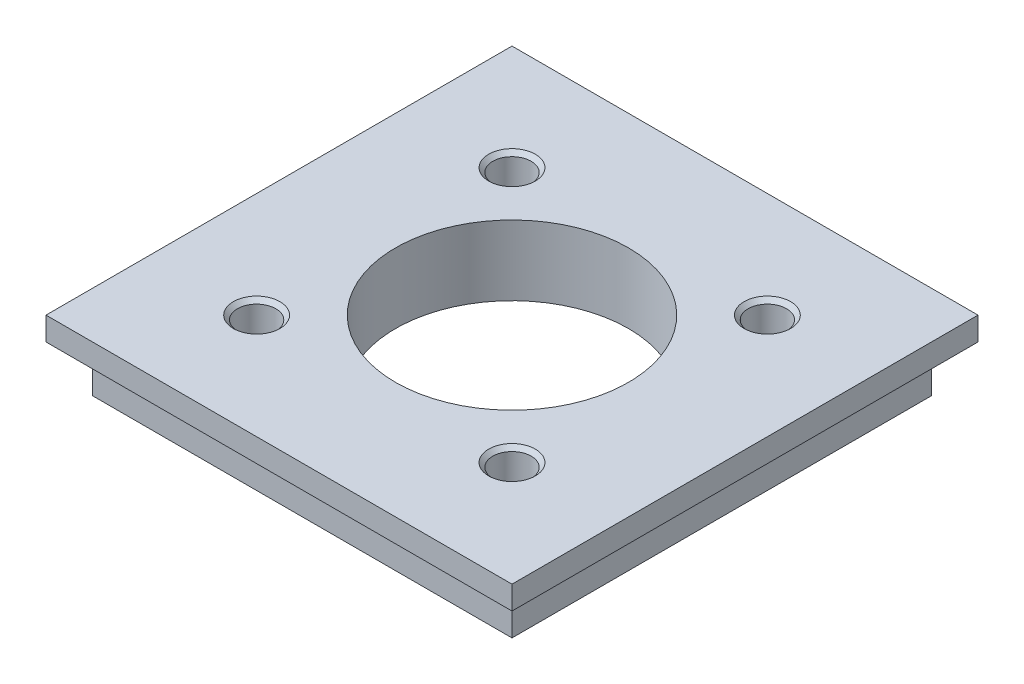
ISO-10303-21;
HEADER;
FILE_DESCRIPTION(('STEP AP214'),'2;1');
FILE_NAME('part.step','',(''),(''),'','','');
FILE_SCHEMA(('AUTOMOTIVE_DESIGN { 1 0 10303 214 1 1 1 1 }'));
ENDSEC;
DATA;
#1=APPLICATION_CONTEXT('core data for automotive mechanical design processes');
#2=APPLICATION_PROTOCOL_DEFINITION('international standard','automotive_design',2000,#1);
#3=PRODUCT_CONTEXT('',#1,'mechanical');
#4=PRODUCT('Part','Part','',(#3));
#5=PRODUCT_RELATED_PRODUCT_CATEGORY('part','',(#4));
#6=PRODUCT_DEFINITION_FORMATION('','',#4);
#7=PRODUCT_DEFINITION_CONTEXT('part definition',#1,'design');
#8=PRODUCT_DEFINITION('design','',#6,#7);
#9=PRODUCT_DEFINITION_SHAPE('','',#8);
#10=(LENGTH_UNIT() NAMED_UNIT(*) SI_UNIT(.MILLI.,.METRE.));
#11=(NAMED_UNIT(*) PLANE_ANGLE_UNIT() SI_UNIT($,.RADIAN.));
#12=(NAMED_UNIT(*) SI_UNIT($,.STERADIAN.) SOLID_ANGLE_UNIT());
#13=UNCERTAINTY_MEASURE_WITH_UNIT(LENGTH_MEASURE(1.E-05),#10,'distance_accuracy_value','');
#14=(GEOMETRIC_REPRESENTATION_CONTEXT(3) GLOBAL_UNCERTAINTY_ASSIGNED_CONTEXT((#13)) GLOBAL_UNIT_ASSIGNED_CONTEXT((#10,
#11,#12)) REPRESENTATION_CONTEXT('',''));
#15=CARTESIAN_POINT('',(0.,0.,0.));
#16=DIRECTION('',(0.,0.,1.));
#17=DIRECTION('',(1.,0.,0.));
#18=AXIS2_PLACEMENT_3D('',#15,#16,#17);
#19=CARTESIAN_POINT('',(20.,2.,20.));
#20=DIRECTION('',(-1.,0.,0.));
#21=DIRECTION('',(0.,0.,1.));
#22=AXIS2_PLACEMENT_3D('',#19,#20,#21);
#23=PLANE('',#22);
#24=DIRECTION('',(0.,0.,-1.));
#25=VECTOR('',#24,1.);
#26=CARTESIAN_POINT('',(20.,0.,20.));
#27=LINE('',#26,#25);
#28=CARTESIAN_POINT('',(20.,0.,20.));
#29=VERTEX_POINT('',#28);
#30=CARTESIAN_POINT('',(20.,0.,-20.));
#31=VERTEX_POINT('',#30);
#32=EDGE_CURVE('E139',#29,#31,#27,.T.);
#33=ORIENTED_EDGE('',*,*,#32,.T.);
#34=DIRECTION('',(0.,-1.,0.));
#35=VECTOR('',#34,1.);
#36=CARTESIAN_POINT('',(20.,2.,-20.));
#37=LINE('',#36,#35);
#38=CARTESIAN_POINT('',(20.,2.,-20.));
#39=VERTEX_POINT('',#38);
#40=EDGE_CURVE('E11',#39,#31,#37,.T.);
#41=ORIENTED_EDGE('',*,*,#40,.F.);
#42=DIRECTION('',(0.,0.,-1.));
#43=VECTOR('',#42,1.);
#44=CARTESIAN_POINT('',(20.,2.,20.));
#45=LINE('',#44,#43);
#46=CARTESIAN_POINT('',(20.,2.,20.));
#47=VERTEX_POINT('',#46);
#48=EDGE_CURVE('E145',#47,#39,#45,.T.);
#49=ORIENTED_EDGE('',*,*,#48,.F.);
#50=DIRECTION('',(0.,-1.,0.));
#51=VECTOR('',#50,1.);
#52=CARTESIAN_POINT('',(20.,2.,20.));
#53=LINE('',#52,#51);
#54=EDGE_CURVE('E159',#47,#29,#53,.T.);
#55=ORIENTED_EDGE('',*,*,#54,.T.);
#56=EDGE_LOOP('',(#33,#41,#49,#55));
#57=FACE_BOUND('',#56,.T.);
#58=ADVANCED_FACE('F45',(#57),#23,.F.);
#59=CARTESIAN_POINT('',(-20.,2.,-20.));
#60=DIRECTION('',(0.,0.,1.));
#61=DIRECTION('',(1.,0.,0.));
#62=AXIS2_PLACEMENT_3D('',#59,#60,#61);
#63=PLANE('',#62);
#64=DIRECTION('',(-1.,0.,0.));
#65=VECTOR('',#64,1.);
#66=CARTESIAN_POINT('',(-20.,0.,-20.));
#67=LINE('',#66,#65);
#68=CARTESIAN_POINT('',(-20.,0.,-20.));
#69=VERTEX_POINT('',#68);
#70=EDGE_CURVE('E163',#31,#69,#67,.T.);
#71=ORIENTED_EDGE('',*,*,#70,.T.);
#72=DIRECTION('',(0.,-1.,0.));
#73=VECTOR('',#72,1.);
#74=CARTESIAN_POINT('',(-20.,2.,-20.));
#75=LINE('',#74,#73);
#76=CARTESIAN_POINT('',(-20.,2.,-20.));
#77=VERTEX_POINT('',#76);
#78=EDGE_CURVE('E53',#77,#69,#75,.T.);
#79=ORIENTED_EDGE('',*,*,#78,.F.);
#80=DIRECTION('',(-1.,0.,0.));
#81=VECTOR('',#80,1.);
#82=CARTESIAN_POINT('',(-20.,2.,-20.));
#83=LINE('',#82,#81);
#84=EDGE_CURVE('E149',#39,#77,#83,.T.);
#85=ORIENTED_EDGE('',*,*,#84,.F.);
#86=ORIENTED_EDGE('',*,*,#40,.T.);
#87=EDGE_LOOP('',(#71,#79,#85,#86));
#88=FACE_BOUND('',#87,.T.);
#89=ADVANCED_FACE('F199',(#88),#63,.F.);
#90=CARTESIAN_POINT('',(-20.,2.,20.));
#91=DIRECTION('',(1.,0.,0.));
#92=DIRECTION('',(0.,0.,-1.));
#93=AXIS2_PLACEMENT_3D('',#90,#91,#92);
#94=PLANE('',#93);
#95=DIRECTION('',(0.,0.,1.));
#96=VECTOR('',#95,1.);
#97=CARTESIAN_POINT('',(-20.,0.,20.));
#98=LINE('',#97,#96);
#99=CARTESIAN_POINT('',(-20.,0.,20.));
#100=VERTEX_POINT('',#99);
#101=EDGE_CURVE('E166',#69,#100,#98,.T.);
#102=ORIENTED_EDGE('',*,*,#101,.T.);
#103=DIRECTION('',(0.,-1.,0.));
#104=VECTOR('',#103,1.);
#105=CARTESIAN_POINT('',(-20.,2.,20.));
#106=LINE('',#105,#104);
#107=CARTESIAN_POINT('',(-20.,2.,20.));
#108=VERTEX_POINT('',#107);
#109=EDGE_CURVE('E174',#108,#100,#106,.T.);
#110=ORIENTED_EDGE('',*,*,#109,.F.);
#111=DIRECTION('',(0.,0.,1.));
#112=VECTOR('',#111,1.);
#113=CARTESIAN_POINT('',(-20.,2.,20.));
#114=LINE('',#113,#112);
#115=EDGE_CURVE('E153',#77,#108,#114,.T.);
#116=ORIENTED_EDGE('',*,*,#115,.F.);
#117=ORIENTED_EDGE('',*,*,#78,.T.);
#118=EDGE_LOOP('',(#102,#110,#116,#117));
#119=FACE_BOUND('',#118,.T.);
#120=ADVANCED_FACE('F183',(#119),#94,.F.);
#121=CARTESIAN_POINT('',(-20.,2.,20.));
#122=DIRECTION('',(0.,0.,-1.));
#123=DIRECTION('',(-1.,0.,0.));
#124=AXIS2_PLACEMENT_3D('',#121,#122,#123);
#125=PLANE('',#124);
#126=DIRECTION('',(1.,0.,0.));
#127=VECTOR('',#126,1.);
#128=CARTESIAN_POINT('',(-20.,0.,20.));
#129=LINE('',#128,#127);
#130=EDGE_CURVE('E150',#100,#29,#129,.T.);
#131=ORIENTED_EDGE('',*,*,#130,.T.);
#132=ORIENTED_EDGE('',*,*,#54,.F.);
#133=DIRECTION('',(1.,0.,0.));
#134=VECTOR('',#133,1.);
#135=CARTESIAN_POINT('',(-20.,2.,20.));
#136=LINE('',#135,#134);
#137=EDGE_CURVE('E156',#108,#47,#136,.T.);
#138=ORIENTED_EDGE('',*,*,#137,.F.);
#139=ORIENTED_EDGE('',*,*,#109,.T.);
#140=EDGE_LOOP('',(#131,#132,#138,#139));
#141=FACE_BOUND('',#140,.T.);
#142=ADVANCED_FACE('F192',(#141),#125,.F.);
#143=CARTESIAN_POINT('',(0.,2.,0.));
#144=DIRECTION('',(0.,-1.,0.));
#145=DIRECTION('',(0.,0.,-1.));
#146=AXIS2_PLACEMENT_3D('',#143,#144,#145);
#147=PLANE('',#146);
#148=CARTESIAN_POINT('',(10.9601551083915,2.,-10.9601551083915));
#149=DIRECTION('',(0.,1.,0.));
#150=DIRECTION('',(0.,0.,1.));
#151=AXIS2_PLACEMENT_3D('',#148,#149,#150);
#152=CIRCLE('',#151,2.);
#153=CARTESIAN_POINT('',(10.9601551083915,2.,-8.96015510839151));
#154=VERTEX_POINT('',#153);
#155=EDGE_CURVE('E272',#154,#154,#152,.T.);
#156=ORIENTED_EDGE('',*,*,#155,.F.);
#157=EDGE_LOOP('',(#156));
#158=FACE_BOUND('',#157,.T.);
#159=CARTESIAN_POINT('',(10.9601551083922,2.,10.9601551083915));
#160=DIRECTION('',(0.,1.,0.));
#161=DIRECTION('',(0.,0.,1.));
#162=AXIS2_PLACEMENT_3D('',#159,#160,#161);
#163=CIRCLE('',#162,2.);
#164=CARTESIAN_POINT('',(10.9601551083922,2.,12.9601551083915));
#165=VERTEX_POINT('',#164);
#166=EDGE_CURVE('E282',#165,#165,#163,.T.);
#167=ORIENTED_EDGE('',*,*,#166,.F.);
#168=EDGE_LOOP('',(#167));
#169=FACE_BOUND('',#168,.T.);
#170=CARTESIAN_POINT('',(-10.9601551083907,2.,10.9601551083922));
#171=DIRECTION('',(0.,1.,0.));
#172=DIRECTION('',(0.,0.,1.));
#173=AXIS2_PLACEMENT_3D('',#170,#171,#172);
#174=CIRCLE('',#173,2.);
#175=CARTESIAN_POINT('',(-10.9601551083907,2.,12.9601551083922));
#176=VERTEX_POINT('',#175);
#177=EDGE_CURVE('E294',#176,#176,#174,.T.);
#178=ORIENTED_EDGE('',*,*,#177,.F.);
#179=EDGE_LOOP('',(#178));
#180=FACE_BOUND('',#179,.T.);
#181=CARTESIAN_POINT('',(-10.9601551083915,2.,-10.9601551083908));
#182=DIRECTION('',(0.,1.,0.));
#183=DIRECTION('',(0.,0.,1.));
#184=AXIS2_PLACEMENT_3D('',#181,#182,#183);
#185=CIRCLE('',#184,2.);
#186=CARTESIAN_POINT('',(-10.9601551083915,2.,-8.96015510839075));
#187=VERTEX_POINT('',#186);
#188=EDGE_CURVE('E306',#187,#187,#185,.T.);
#189=ORIENTED_EDGE('',*,*,#188,.F.);
#190=EDGE_LOOP('',(#189));
#191=FACE_BOUND('',#190,.T.);
#192=CARTESIAN_POINT('',(0.,2.,0.));
#193=DIRECTION('',(0.,-1.,0.));
#194=DIRECTION('',(0.,0.,-1.));
#195=AXIS2_PLACEMENT_3D('',#192,#193,#194);
#196=CIRCLE('',#195,10.);
#197=CARTESIAN_POINT('',(0.,2.,-10.));
#198=VERTEX_POINT('',#197);
#199=EDGE_CURVE('E134',#198,#198,#196,.T.);
#200=ORIENTED_EDGE('',*,*,#199,.T.);
#201=EDGE_LOOP('',(#200));
#202=FACE_BOUND('',#201,.T.);
#203=ORIENTED_EDGE('',*,*,#48,.T.);
#204=ORIENTED_EDGE('',*,*,#84,.T.);
#205=ORIENTED_EDGE('',*,*,#115,.T.);
#206=ORIENTED_EDGE('',*,*,#137,.T.);
#207=EDGE_LOOP('',(#203,#204,#205,#206));
#208=FACE_BOUND('',#207,.T.);
#209=ADVANCED_FACE('F198',(#158,#169,#180,#191,#202,#208),#147,.F.);
#210=CARTESIAN_POINT('',(0.,0.,0.));
#211=DIRECTION('',(0.,-1.,0.));
#212=DIRECTION('',(0.,0.,-1.));
#213=AXIS2_PLACEMENT_3D('',#210,#211,#212);
#214=PLANE('',#213);
#215=DIRECTION('',(1.,0.,0.));
#216=VECTOR('',#215,1.);
#217=CARTESIAN_POINT('',(-18.,0.,-18.));
#218=LINE('',#217,#216);
#219=CARTESIAN_POINT('',(-18.,0.,-18.));
#220=VERTEX_POINT('',#219);
#221=CARTESIAN_POINT('',(18.,0.,-18.));
#222=VERTEX_POINT('',#221);
#223=EDGE_CURVE('E60',#220,#222,#218,.T.);
#224=ORIENTED_EDGE('',*,*,#223,.F.);
#225=DIRECTION('',(0.,0.,-1.));
#226=VECTOR('',#225,1.);
#227=CARTESIAN_POINT('',(-18.,0.,18.));
#228=LINE('',#227,#226);
#229=CARTESIAN_POINT('',(-18.,0.,18.));
#230=VERTEX_POINT('',#229);
#231=EDGE_CURVE('E64',#230,#220,#228,.T.);
#232=ORIENTED_EDGE('',*,*,#231,.F.);
#233=DIRECTION('',(-1.,0.,0.));
#234=VECTOR('',#233,1.);
#235=CARTESIAN_POINT('',(18.,0.,18.));
#236=LINE('',#235,#234);
#237=CARTESIAN_POINT('',(18.,0.,18.));
#238=VERTEX_POINT('',#237);
#239=EDGE_CURVE('E332',#238,#230,#236,.T.);
#240=ORIENTED_EDGE('',*,*,#239,.F.);
#241=DIRECTION('',(0.,0.,1.));
#242=VECTOR('',#241,1.);
#243=CARTESIAN_POINT('',(18.,0.,-18.));
#244=LINE('',#243,#242);
#245=EDGE_CURVE('E329',#222,#238,#244,.T.);
#246=ORIENTED_EDGE('',*,*,#245,.F.);
#247=EDGE_LOOP('',(#224,#232,#240,#246));
#248=FACE_BOUND('',#247,.T.);
#249=ORIENTED_EDGE('',*,*,#32,.F.);
#250=ORIENTED_EDGE('',*,*,#130,.F.);
#251=ORIENTED_EDGE('',*,*,#101,.F.);
#252=ORIENTED_EDGE('',*,*,#70,.F.);
#253=EDGE_LOOP('',(#249,#250,#251,#252));
#254=FACE_BOUND('',#253,.T.);
#255=ADVANCED_FACE('F189',(#248,#254),#214,.T.);
#256=CARTESIAN_POINT('',(0.,0.,0.));
#257=DIRECTION('',(0.,-1.,0.));
#258=DIRECTION('',(0.,0.,-1.));
#259=AXIS2_PLACEMENT_3D('',#256,#257,#258);
#260=CYLINDRICAL_SURFACE('',#259,10.);
#261=ORIENTED_EDGE('',*,*,#199,.F.);
#262=EDGE_LOOP('',(#261));
#263=FACE_BOUND('',#262,.T.);
#264=CARTESIAN_POINT('',(0.,-4.,0.));
#265=DIRECTION('',(0.,-1.,0.));
#266=DIRECTION('',(0.,0.,-1.));
#267=AXIS2_PLACEMENT_3D('',#264,#265,#266);
#268=CIRCLE('',#267,10.);
#269=CARTESIAN_POINT('',(0.,-4.,-10.));
#270=VERTEX_POINT('',#269);
#271=EDGE_CURVE('E318',#270,#270,#268,.T.);
#272=ORIENTED_EDGE('',*,*,#271,.T.);
#273=EDGE_LOOP('',(#272));
#274=FACE_BOUND('',#273,.T.);
#275=ADVANCED_FACE('F211',(#263,#274),#260,.F.);
#276=CARTESIAN_POINT('',(0.,-4.,0.));
#277=DIRECTION('',(0.,-1.,0.));
#278=DIRECTION('',(0.,0.,-1.));
#279=AXIS2_PLACEMENT_3D('',#276,#277,#278);
#280=PLANE('',#279);
#281=CARTESIAN_POINT('',(10.9601551083915,-4.,-10.9601551083915));
#282=DIRECTION('',(0.,1.,0.));
#283=DIRECTION('',(0.,0.,1.));
#284=AXIS2_PLACEMENT_3D('',#281,#282,#283);
#285=CIRCLE('',#284,1.65);
#286=CARTESIAN_POINT('',(10.9601551083915,-4.,-9.31015510839151));
#287=VERTEX_POINT('',#286);
#288=EDGE_CURVE('E276',#287,#287,#285,.T.);
#289=ORIENTED_EDGE('',*,*,#288,.T.);
#290=EDGE_LOOP('',(#289));
#291=FACE_BOUND('',#290,.T.);
#292=CARTESIAN_POINT('',(10.9601551083922,-4.,10.9601551083915));
#293=DIRECTION('',(0.,1.,0.));
#294=DIRECTION('',(0.,0.,1.));
#295=AXIS2_PLACEMENT_3D('',#292,#293,#294);
#296=CIRCLE('',#295,1.65);
#297=CARTESIAN_POINT('',(10.9601551083922,-4.,12.6101551083915));
#298=VERTEX_POINT('',#297);
#299=EDGE_CURVE('E290',#298,#298,#296,.T.);
#300=ORIENTED_EDGE('',*,*,#299,.T.);
#301=EDGE_LOOP('',(#300));
#302=FACE_BOUND('',#301,.T.);
#303=CARTESIAN_POINT('',(-10.9601551083907,-4.,10.9601551083922));
#304=DIRECTION('',(0.,1.,0.));
#305=DIRECTION('',(0.,0.,1.));
#306=AXIS2_PLACEMENT_3D('',#303,#304,#305);
#307=CIRCLE('',#306,1.65);
#308=CARTESIAN_POINT('',(-10.9601551083907,-4.,12.6101551083922));
#309=VERTEX_POINT('',#308);
#310=EDGE_CURVE('E302',#309,#309,#307,.T.);
#311=ORIENTED_EDGE('',*,*,#310,.T.);
#312=EDGE_LOOP('',(#311));
#313=FACE_BOUND('',#312,.T.);
#314=CARTESIAN_POINT('',(-10.9601551083915,-4.,-10.9601551083908));
#315=DIRECTION('',(0.,1.,0.));
#316=DIRECTION('',(0.,0.,1.));
#317=AXIS2_PLACEMENT_3D('',#314,#315,#316);
#318=CIRCLE('',#317,1.65);
#319=CARTESIAN_POINT('',(-10.9601551083915,-4.,-9.31015510839075));
#320=VERTEX_POINT('',#319);
#321=EDGE_CURVE('E314',#320,#320,#318,.T.);
#322=ORIENTED_EDGE('',*,*,#321,.T.);
#323=EDGE_LOOP('',(#322));
#324=FACE_BOUND('',#323,.T.);
#325=DIRECTION('',(1.,0.,0.));
#326=VECTOR('',#325,1.);
#327=CARTESIAN_POINT('',(-18.,-4.,-18.));
#328=LINE('',#327,#326);
#329=CARTESIAN_POINT('',(-18.,-4.,-18.));
#330=VERTEX_POINT('',#329);
#331=CARTESIAN_POINT('',(18.,-4.,-18.));
#332=VERTEX_POINT('',#331);
#333=EDGE_CURVE('E120',#330,#332,#328,.T.);
#334=ORIENTED_EDGE('',*,*,#333,.T.);
#335=DIRECTION('',(0.,0.,1.));
#336=VECTOR('',#335,1.);
#337=CARTESIAN_POINT('',(18.,-4.,-18.));
#338=LINE('',#337,#336);
#339=CARTESIAN_POINT('',(18.,-4.,18.));
#340=VERTEX_POINT('',#339);
#341=EDGE_CURVE('E108',#332,#340,#338,.T.);
#342=ORIENTED_EDGE('',*,*,#341,.T.);
#343=DIRECTION('',(-1.,0.,0.));
#344=VECTOR('',#343,1.);
#345=CARTESIAN_POINT('',(18.,-4.,18.));
#346=LINE('',#345,#344);
#347=CARTESIAN_POINT('',(-18.,-4.,18.));
#348=VERTEX_POINT('',#347);
#349=EDGE_CURVE('E119',#340,#348,#346,.T.);
#350=ORIENTED_EDGE('',*,*,#349,.T.);
#351=DIRECTION('',(0.,0.,-1.));
#352=VECTOR('',#351,1.);
#353=CARTESIAN_POINT('',(-18.,-4.,18.));
#354=LINE('',#353,#352);
#355=EDGE_CURVE('E126',#348,#330,#354,.T.);
#356=ORIENTED_EDGE('',*,*,#355,.T.);
#357=EDGE_LOOP('',(#334,#342,#350,#356));
#358=FACE_BOUND('',#357,.T.);
#359=ORIENTED_EDGE('',*,*,#271,.F.);
#360=EDGE_LOOP('',(#359));
#361=FACE_BOUND('',#360,.T.);
#362=ADVANCED_FACE('F123',(#291,#302,#313,#324,#358,#361),#280,.T.);
#363=CARTESIAN_POINT('',(-18.,-4.,-18.));
#364=DIRECTION('',(0.,0.,1.));
#365=DIRECTION('',(1.,0.,0.));
#366=AXIS2_PLACEMENT_3D('',#363,#364,#365);
#367=PLANE('',#366);
#368=ORIENTED_EDGE('',*,*,#223,.T.);
#369=DIRECTION('',(0.,1.,0.));
#370=VECTOR('',#369,1.);
#371=CARTESIAN_POINT('',(18.,-4.,-18.));
#372=LINE('',#371,#370);
#373=EDGE_CURVE('E113',#332,#222,#372,.T.);
#374=ORIENTED_EDGE('',*,*,#373,.F.);
#375=ORIENTED_EDGE('',*,*,#333,.F.);
#376=DIRECTION('',(0.,1.,0.));
#377=VECTOR('',#376,1.);
#378=CARTESIAN_POINT('',(-18.,-4.,-18.));
#379=LINE('',#378,#377);
#380=EDGE_CURVE('E326',#330,#220,#379,.T.);
#381=ORIENTED_EDGE('',*,*,#380,.T.);
#382=EDGE_LOOP('',(#368,#374,#375,#381));
#383=FACE_BOUND('',#382,.T.);
#384=ADVANCED_FACE('F132',(#383),#367,.F.);
#385=CARTESIAN_POINT('',(18.,-4.,-18.));
#386=DIRECTION('',(-1.,0.,0.));
#387=DIRECTION('',(0.,0.,1.));
#388=AXIS2_PLACEMENT_3D('',#385,#386,#387);
#389=PLANE('',#388);
#390=ORIENTED_EDGE('',*,*,#245,.T.);
#391=DIRECTION('',(0.,1.,0.));
#392=VECTOR('',#391,1.);
#393=CARTESIAN_POINT('',(18.,-4.,18.));
#394=LINE('',#393,#392);
#395=EDGE_CURVE('E115',#340,#238,#394,.T.);
#396=ORIENTED_EDGE('',*,*,#395,.F.);
#397=ORIENTED_EDGE('',*,*,#341,.F.);
#398=ORIENTED_EDGE('',*,*,#373,.T.);
#399=EDGE_LOOP('',(#390,#396,#397,#398));
#400=FACE_BOUND('',#399,.T.);
#401=ADVANCED_FACE('F111',(#400),#389,.F.);
#402=CARTESIAN_POINT('',(18.,-4.,18.));
#403=DIRECTION('',(0.,0.,-1.));
#404=DIRECTION('',(-1.,0.,0.));
#405=AXIS2_PLACEMENT_3D('',#402,#403,#404);
#406=PLANE('',#405);
#407=ORIENTED_EDGE('',*,*,#239,.T.);
#408=DIRECTION('',(0.,1.,0.));
#409=VECTOR('',#408,1.);
#410=CARTESIAN_POINT('',(-18.,-4.,18.));
#411=LINE('',#410,#409);
#412=EDGE_CURVE('E141',#348,#230,#411,.T.);
#413=ORIENTED_EDGE('',*,*,#412,.F.);
#414=ORIENTED_EDGE('',*,*,#349,.F.);
#415=ORIENTED_EDGE('',*,*,#395,.T.);
#416=EDGE_LOOP('',(#407,#413,#414,#415));
#417=FACE_BOUND('',#416,.T.);
#418=ADVANCED_FACE('F222',(#417),#406,.F.);
#419=CARTESIAN_POINT('',(-18.,-4.,18.));
#420=DIRECTION('',(1.,0.,0.));
#421=DIRECTION('',(0.,0.,-1.));
#422=AXIS2_PLACEMENT_3D('',#419,#420,#421);
#423=PLANE('',#422);
#424=ORIENTED_EDGE('',*,*,#231,.T.);
#425=ORIENTED_EDGE('',*,*,#380,.F.);
#426=ORIENTED_EDGE('',*,*,#355,.F.);
#427=ORIENTED_EDGE('',*,*,#412,.T.);
#428=EDGE_LOOP('',(#424,#425,#426,#427));
#429=FACE_BOUND('',#428,.T.);
#430=ADVANCED_FACE('F225',(#429),#423,.F.);
#431=CARTESIAN_POINT('',(-10.9601551083915,2.,-10.9601551083908));
#432=DIRECTION('',(0.,1.,0.));
#433=DIRECTION('',(0.,0.,1.));
#434=AXIS2_PLACEMENT_3D('',#431,#432,#433);
#435=CYLINDRICAL_SURFACE('',#434,1.65);
#436=ORIENTED_EDGE('',*,*,#321,.F.);
#437=EDGE_LOOP('',(#436));
#438=FACE_BOUND('',#437,.T.);
#439=CARTESIAN_POINT('',(-10.9601551083915,1.65,-10.9601551083908));
#440=DIRECTION('',(0.,1.,0.));
#441=DIRECTION('',(0.,0.,1.));
#442=AXIS2_PLACEMENT_3D('',#439,#440,#441);
#443=CIRCLE('',#442,1.65);
#444=CARTESIAN_POINT('',(-10.9601551083915,1.65,-9.31015510839075));
#445=VERTEX_POINT('',#444);
#446=EDGE_CURVE('E310',#445,#445,#443,.T.);
#447=ORIENTED_EDGE('',*,*,#446,.T.);
#448=EDGE_LOOP('',(#447));
#449=FACE_BOUND('',#448,.T.);
#450=ADVANCED_FACE('F229',(#438,#449),#435,.F.);
#451=CARTESIAN_POINT('',(-10.9601551083915,2.,-10.9601551083908));
#452=DIRECTION('',(0.,1.,0.));
#453=DIRECTION('',(0.,0.,1.));
#454=AXIS2_PLACEMENT_3D('',#451,#452,#453);
#455=CONICAL_SURFACE('',#454,2.,0.78539816339745);
#456=ORIENTED_EDGE('',*,*,#446,.F.);
#457=EDGE_LOOP('',(#456));
#458=FACE_BOUND('',#457,.T.);
#459=ORIENTED_EDGE('',*,*,#188,.T.);
#460=EDGE_LOOP('',(#459));
#461=FACE_BOUND('',#460,.T.);
#462=ADVANCED_FACE('F236',(#458,#461),#455,.F.);
#463=CARTESIAN_POINT('',(-10.9601551083907,2.,10.9601551083922));
#464=DIRECTION('',(0.,1.,0.));
#465=DIRECTION('',(0.,0.,1.));
#466=AXIS2_PLACEMENT_3D('',#463,#464,#465);
#467=CYLINDRICAL_SURFACE('',#466,1.65);
#468=ORIENTED_EDGE('',*,*,#310,.F.);
#469=EDGE_LOOP('',(#468));
#470=FACE_BOUND('',#469,.T.);
#471=CARTESIAN_POINT('',(-10.9601551083907,1.65,10.9601551083922));
#472=DIRECTION('',(0.,1.,0.));
#473=DIRECTION('',(0.,0.,1.));
#474=AXIS2_PLACEMENT_3D('',#471,#472,#473);
#475=CIRCLE('',#474,1.65);
#476=CARTESIAN_POINT('',(-10.9601551083907,1.65,12.6101551083922));
#477=VERTEX_POINT('',#476);
#478=EDGE_CURVE('E298',#477,#477,#475,.T.);
#479=ORIENTED_EDGE('',*,*,#478,.T.);
#480=EDGE_LOOP('',(#479));
#481=FACE_BOUND('',#480,.T.);
#482=ADVANCED_FACE('F240',(#470,#481),#467,.F.);
#483=CARTESIAN_POINT('',(-10.9601551083907,2.,10.9601551083922));
#484=DIRECTION('',(0.,1.,0.));
#485=DIRECTION('',(0.,0.,1.));
#486=AXIS2_PLACEMENT_3D('',#483,#484,#485);
#487=CONICAL_SURFACE('',#486,2.,0.78539816339745);
#488=ORIENTED_EDGE('',*,*,#478,.F.);
#489=EDGE_LOOP('',(#488));
#490=FACE_BOUND('',#489,.T.);
#491=ORIENTED_EDGE('',*,*,#177,.T.);
#492=EDGE_LOOP('',(#491));
#493=FACE_BOUND('',#492,.T.);
#494=ADVANCED_FACE('F244',(#490,#493),#487,.F.);
#495=CARTESIAN_POINT('',(10.9601551083922,2.,10.9601551083915));
#496=DIRECTION('',(0.,1.,0.));
#497=DIRECTION('',(0.,0.,1.));
#498=AXIS2_PLACEMENT_3D('',#495,#496,#497);
#499=CYLINDRICAL_SURFACE('',#498,1.65);
#500=ORIENTED_EDGE('',*,*,#299,.F.);
#501=EDGE_LOOP('',(#500));
#502=FACE_BOUND('',#501,.T.);
#503=CARTESIAN_POINT('',(10.9601551083922,1.65,10.9601551083915));
#504=DIRECTION('',(0.,1.,0.));
#505=DIRECTION('',(0.,0.,1.));
#506=AXIS2_PLACEMENT_3D('',#503,#504,#505);
#507=CIRCLE('',#506,1.65);
#508=CARTESIAN_POINT('',(10.9601551083922,1.65,12.6101551083915));
#509=VERTEX_POINT('',#508);
#510=EDGE_CURVE('E286',#509,#509,#507,.T.);
#511=ORIENTED_EDGE('',*,*,#510,.T.);
#512=EDGE_LOOP('',(#511));
#513=FACE_BOUND('',#512,.T.);
#514=ADVANCED_FACE('F248',(#502,#513),#499,.F.);
#515=CARTESIAN_POINT('',(10.9601551083922,2.,10.9601551083915));
#516=DIRECTION('',(0.,1.,0.));
#517=DIRECTION('',(0.,0.,1.));
#518=AXIS2_PLACEMENT_3D('',#515,#516,#517);
#519=CONICAL_SURFACE('',#518,2.,0.78539816339745);
#520=ORIENTED_EDGE('',*,*,#510,.F.);
#521=EDGE_LOOP('',(#520));
#522=FACE_BOUND('',#521,.T.);
#523=ORIENTED_EDGE('',*,*,#166,.T.);
#524=EDGE_LOOP('',(#523));
#525=FACE_BOUND('',#524,.T.);
#526=ADVANCED_FACE('F252',(#522,#525),#519,.F.);
#527=CARTESIAN_POINT('',(10.9601551083915,2.,-10.9601551083915));
#528=DIRECTION('',(0.,1.,0.));
#529=DIRECTION('',(0.,0.,1.));
#530=AXIS2_PLACEMENT_3D('',#527,#528,#529);
#531=CYLINDRICAL_SURFACE('',#530,1.65);
#532=ORIENTED_EDGE('',*,*,#288,.F.);
#533=EDGE_LOOP('',(#532));
#534=FACE_BOUND('',#533,.T.);
#535=CARTESIAN_POINT('',(10.9601551083915,1.65,-10.9601551083915));
#536=DIRECTION('',(0.,1.,0.));
#537=DIRECTION('',(0.,0.,1.));
#538=AXIS2_PLACEMENT_3D('',#535,#536,#537);
#539=CIRCLE('',#538,1.65);
#540=CARTESIAN_POINT('',(10.9601551083915,1.65,-9.31015510839151));
#541=VERTEX_POINT('',#540);
#542=EDGE_CURVE('E269',#541,#541,#539,.T.);
#543=ORIENTED_EDGE('',*,*,#542,.T.);
#544=EDGE_LOOP('',(#543));
#545=FACE_BOUND('',#544,.T.);
#546=ADVANCED_FACE('F256',(#534,#545),#531,.F.);
#547=CARTESIAN_POINT('',(10.9601551083915,2.,-10.9601551083915));
#548=DIRECTION('',(0.,1.,0.));
#549=DIRECTION('',(0.,0.,1.));
#550=AXIS2_PLACEMENT_3D('',#547,#548,#549);
#551=CONICAL_SURFACE('',#550,2.,0.78539816339745);
#552=ORIENTED_EDGE('',*,*,#542,.F.);
#553=EDGE_LOOP('',(#552));
#554=FACE_BOUND('',#553,.T.);
#555=ORIENTED_EDGE('',*,*,#155,.T.);
#556=EDGE_LOOP('',(#555));
#557=FACE_BOUND('',#556,.T.);
#558=ADVANCED_FACE('F260',(#554,#557),#551,.F.);
#559=CLOSED_SHELL('',(#58,#89,#120,#142,#209,#255,#275,#362,#384,#401,#418,#430,#450,#462,#482,
#494,#514,#526,#546,#558));
#560=MANIFOLD_SOLID_BREP('B2',#559);
#561=ADVANCED_BREP_SHAPE_REPRESENTATION('',(#18,#560),#14);
#562=SHAPE_DEFINITION_REPRESENTATION(#9,#561);
ENDSEC;
END-ISO-10303-21;
